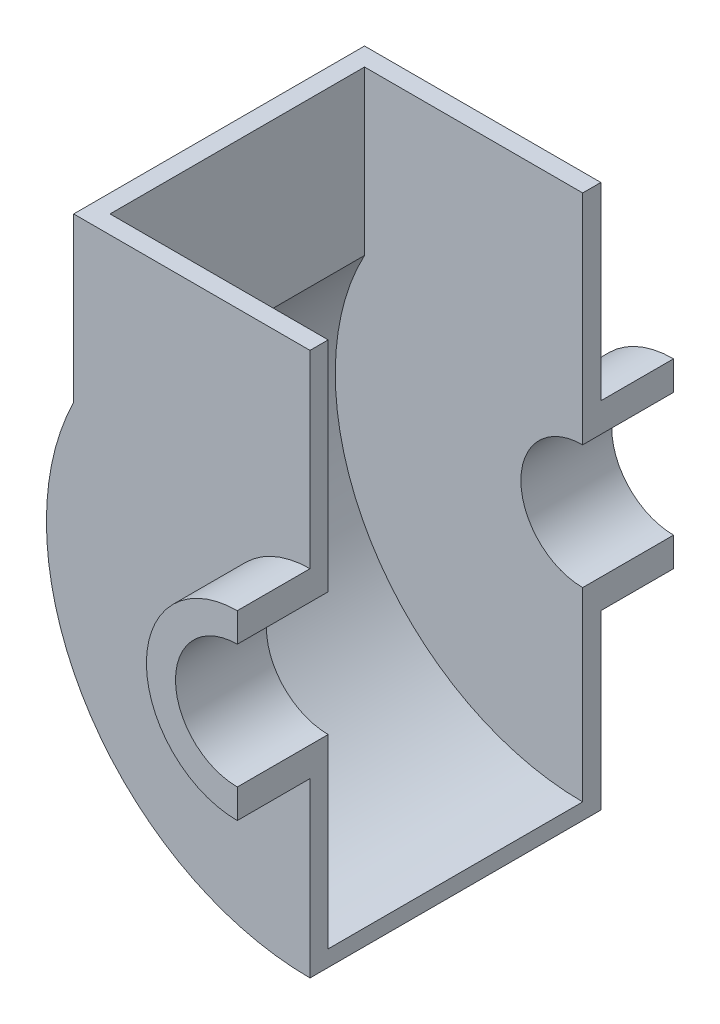
ISO-10303-21;
HEADER;
FILE_DESCRIPTION(('STEP AP214'),'2;1');
FILE_NAME('part.step','',(''),(''),'','','');
FILE_SCHEMA(('AUTOMOTIVE_DESIGN { 1 0 10303 214 1 1 1 1 }'));
ENDSEC;
DATA;
#1=APPLICATION_CONTEXT('core data for automotive mechanical design processes');
#2=APPLICATION_PROTOCOL_DEFINITION('international standard','automotive_design',2000,#1);
#3=PRODUCT_CONTEXT('',#1,'mechanical');
#4=PRODUCT('Part','Part','',(#3));
#5=PRODUCT_RELATED_PRODUCT_CATEGORY('part','',(#4));
#6=PRODUCT_DEFINITION_FORMATION('','',#4);
#7=PRODUCT_DEFINITION_CONTEXT('part definition',#1,'design');
#8=PRODUCT_DEFINITION('design','',#6,#7);
#9=PRODUCT_DEFINITION_SHAPE('','',#8);
#10=(LENGTH_UNIT() NAMED_UNIT(*) SI_UNIT(.MILLI.,.METRE.));
#11=(NAMED_UNIT(*) PLANE_ANGLE_UNIT() SI_UNIT($,.RADIAN.));
#12=(NAMED_UNIT(*) SI_UNIT($,.STERADIAN.) SOLID_ANGLE_UNIT());
#13=UNCERTAINTY_MEASURE_WITH_UNIT(LENGTH_MEASURE(1.E-05),#10,'distance_accuracy_value','');
#14=(GEOMETRIC_REPRESENTATION_CONTEXT(3) GLOBAL_UNCERTAINTY_ASSIGNED_CONTEXT((#13)) GLOBAL_UNIT_ASSIGNED_CONTEXT((#10,
#11,#12)) REPRESENTATION_CONTEXT('',''));
#15=CARTESIAN_POINT('',(0.,0.,0.));
#16=DIRECTION('',(0.,0.,1.));
#17=DIRECTION('',(1.,0.,0.));
#18=AXIS2_PLACEMENT_3D('',#15,#16,#17);
#19=CARTESIAN_POINT('',(0.,0.,-5.));
#20=DIRECTION('',(0.,0.,1.));
#21=DIRECTION('',(1.,0.,0.));
#22=AXIS2_PLACEMENT_3D('',#19,#20,#21);
#23=PLANE('',#22);
#24=CARTESIAN_POINT('',(0.,0.,-5.));
#25=DIRECTION('',(0.,0.,1.));
#26=DIRECTION('',(-1.,0.,0.));
#27=AXIS2_PLACEMENT_3D('',#24,#25,#26);
#28=CIRCLE('',#27,68.053287944081);
#29=CARTESIAN_POINT('',(-60.,32.1130814466628,-5.));
#30=VERTEX_POINT('',#29);
#31=CARTESIAN_POINT('',(0.,-68.053287944081,-5.));
#32=VERTEX_POINT('',#31);
#33=EDGE_CURVE('E196',#30,#32,#28,.T.);
#34=ORIENTED_EDGE('',*,*,#33,.F.);
#35=DIRECTION('',(0.,-1.,0.));
#36=VECTOR('',#35,1.);
#37=CARTESIAN_POINT('',(-60.,77.,-5.));
#38=LINE('',#37,#36);
#39=CARTESIAN_POINT('',(-60.,77.,-5.));
#40=VERTEX_POINT('',#39);
#41=EDGE_CURVE('E55',#40,#30,#38,.T.);
#42=ORIENTED_EDGE('',*,*,#41,.F.);
#43=DIRECTION('',(-1.,0.,0.));
#44=VECTOR('',#43,1.);
#45=CARTESIAN_POINT('',(0.,77.,-5.));
#46=LINE('',#45,#44);
#47=CARTESIAN_POINT('',(0.,77.,-5.));
#48=VERTEX_POINT('',#47);
#49=EDGE_CURVE('E212',#48,#40,#46,.T.);
#50=ORIENTED_EDGE('',*,*,#49,.F.);
#51=DIRECTION('',(0.,1.,0.));
#52=VECTOR('',#51,1.);
#53=CARTESIAN_POINT('',(0.,25.,-5.));
#54=LINE('',#53,#52);
#55=CARTESIAN_POINT('',(0.,17.,-5.));
#56=VERTEX_POINT('',#55);
#57=EDGE_CURVE('E254',#56,#48,#54,.T.);
#58=ORIENTED_EDGE('',*,*,#57,.F.);
#59=CARTESIAN_POINT('',(0.,0.,-5.));
#60=DIRECTION('',(0.,0.,-1.));
#61=DIRECTION('',(1.,0.,0.));
#62=AXIS2_PLACEMENT_3D('',#59,#60,#61);
#63=CIRCLE('',#62,17.);
#64=CARTESIAN_POINT('',(0.,-17.,-5.));
#65=VERTEX_POINT('',#64);
#66=EDGE_CURVE('E251',#65,#56,#63,.T.);
#67=ORIENTED_EDGE('',*,*,#66,.F.);
#68=DIRECTION('',(0.,1.,0.));
#69=VECTOR('',#68,1.);
#70=CARTESIAN_POINT('',(0.,-17.,-5.));
#71=LINE('',#70,#69);
#72=EDGE_CURVE('E61',#32,#65,#71,.T.);
#73=ORIENTED_EDGE('',*,*,#72,.F.);
#74=EDGE_LOOP('',(#34,#42,#50,#58,#67,#73));
#75=FACE_BOUND('',#74,.T.);
#76=ADVANCED_FACE('F38',(#75),#23,.F.);
#77=CARTESIAN_POINT('',(0.,0.,-5.));
#78=DIRECTION('',(0.,0.,1.));
#79=DIRECTION('',(1.,0.,0.));
#80=AXIS2_PLACEMENT_3D('',#77,#78,#79);
#81=CYLINDRICAL_SURFACE('',#80,25.);
#82=CARTESIAN_POINT('',(0.,0.,0.));
#83=DIRECTION('',(0.,0.,1.));
#84=DIRECTION('',(1.,0.,0.));
#85=AXIS2_PLACEMENT_3D('',#82,#83,#84);
#86=CIRCLE('',#85,25.);
#87=CARTESIAN_POINT('',(0.,25.,0.));
#88=VERTEX_POINT('',#87);
#89=CARTESIAN_POINT('',(0.,-25.,0.));
#90=VERTEX_POINT('',#89);
#91=EDGE_CURVE('E205',#88,#90,#86,.T.);
#92=ORIENTED_EDGE('',*,*,#91,.T.);
#93=DIRECTION('',(0.,0.,1.));
#94=VECTOR('',#93,1.);
#95=CARTESIAN_POINT('',(0.,-25.,-5.));
#96=LINE('',#95,#94);
#97=CARTESIAN_POINT('',(0.,-25.,20.));
#98=VERTEX_POINT('',#97);
#99=EDGE_CURVE('E42',#90,#98,#96,.T.);
#100=ORIENTED_EDGE('',*,*,#99,.T.);
#101=CARTESIAN_POINT('',(0.,0.,20.));
#102=DIRECTION('',(0.,0.,1.));
#103=DIRECTION('',(1.,0.,0.));
#104=AXIS2_PLACEMENT_3D('',#101,#102,#103);
#105=CIRCLE('',#104,25.);
#106=CARTESIAN_POINT('',(0.,25.,20.));
#107=VERTEX_POINT('',#106);
#108=EDGE_CURVE('E233',#107,#98,#105,.T.);
#109=ORIENTED_EDGE('',*,*,#108,.F.);
#110=DIRECTION('',(0.,0.,1.));
#111=VECTOR('',#110,1.);
#112=CARTESIAN_POINT('',(0.,25.,-5.));
#113=LINE('',#112,#111);
#114=EDGE_CURVE('E11',#88,#107,#113,.T.);
#115=ORIENTED_EDGE('',*,*,#114,.F.);
#116=EDGE_LOOP('',(#92,#100,#109,#115));
#117=FACE_BOUND('',#116,.T.);
#118=ADVANCED_FACE('F40',(#117),#81,.T.);
#119=CARTESIAN_POINT('',(0.,25.,-5.));
#120=DIRECTION('',(1.,0.,0.));
#121=DIRECTION('',(0.,0.,-1.));
#122=AXIS2_PLACEMENT_3D('',#119,#120,#121);
#123=PLANE('',#122);
#124=ORIENTED_EDGE('',*,*,#57,.T.);
#125=DIRECTION('',(0.,0.,1.));
#126=VECTOR('',#125,1.);
#127=CARTESIAN_POINT('',(0.,77.,-5.));
#128=LINE('',#127,#126);
#129=CARTESIAN_POINT('',(0.,77.,0.));
#130=VERTEX_POINT('',#129);
#131=EDGE_CURVE('E214',#48,#130,#128,.T.);
#132=ORIENTED_EDGE('',*,*,#131,.T.);
#133=DIRECTION('',(0.,1.,0.));
#134=VECTOR('',#133,1.);
#135=CARTESIAN_POINT('',(0.,0.,0.));
#136=LINE('',#135,#134);
#137=EDGE_CURVE('E217',#88,#130,#136,.T.);
#138=ORIENTED_EDGE('',*,*,#137,.F.);
#139=ORIENTED_EDGE('',*,*,#114,.T.);
#140=DIRECTION('',(0.,1.,0.));
#141=VECTOR('',#140,1.);
#142=CARTESIAN_POINT('',(0.,25.,20.));
#143=LINE('',#142,#141);
#144=CARTESIAN_POINT('',(0.,17.,20.));
#145=VERTEX_POINT('',#144);
#146=EDGE_CURVE('E247',#145,#107,#143,.T.);
#147=ORIENTED_EDGE('',*,*,#146,.F.);
#148=DIRECTION('',(0.,0.,1.));
#149=VECTOR('',#148,1.);
#150=CARTESIAN_POINT('',(0.,17.,-5.));
#151=LINE('',#150,#149);
#152=EDGE_CURVE('E47',#56,#145,#151,.T.);
#153=ORIENTED_EDGE('',*,*,#152,.F.);
#154=EDGE_LOOP('',(#124,#132,#138,#139,#147,#153));
#155=FACE_BOUND('',#154,.T.);
#156=ADVANCED_FACE('F271',(#155),#123,.T.);
#157=CARTESIAN_POINT('',(0.,0.,-5.));
#158=DIRECTION('',(0.,0.,1.));
#159=DIRECTION('',(1.,0.,0.));
#160=AXIS2_PLACEMENT_3D('',#157,#158,#159);
#161=CYLINDRICAL_SURFACE('',#160,17.);
#162=ORIENTED_EDGE('',*,*,#152,.T.);
#163=CARTESIAN_POINT('',(0.,0.,20.));
#164=DIRECTION('',(0.,0.,-1.));
#165=DIRECTION('',(1.,0.,0.));
#166=AXIS2_PLACEMENT_3D('',#163,#164,#165);
#167=CIRCLE('',#166,17.);
#168=CARTESIAN_POINT('',(0.,-17.,20.));
#169=VERTEX_POINT('',#168);
#170=EDGE_CURVE('E244',#169,#145,#167,.T.);
#171=ORIENTED_EDGE('',*,*,#170,.F.);
#172=DIRECTION('',(0.,0.,1.));
#173=VECTOR('',#172,1.);
#174=CARTESIAN_POINT('',(0.,-17.,-5.));
#175=LINE('',#174,#173);
#176=EDGE_CURVE('E256',#65,#169,#175,.T.);
#177=ORIENTED_EDGE('',*,*,#176,.F.);
#178=ORIENTED_EDGE('',*,*,#66,.T.);
#179=EDGE_LOOP('',(#162,#171,#177,#178));
#180=FACE_BOUND('',#179,.T.);
#181=ADVANCED_FACE('F323',(#180),#161,.F.);
#182=CARTESIAN_POINT('',(0.,-17.,-5.));
#183=DIRECTION('',(1.,0.,0.));
#184=DIRECTION('',(0.,0.,-1.));
#185=AXIS2_PLACEMENT_3D('',#182,#183,#184);
#186=PLANE('',#185);
#187=ORIENTED_EDGE('',*,*,#176,.T.);
#188=DIRECTION('',(0.,1.,0.));
#189=VECTOR('',#188,1.);
#190=CARTESIAN_POINT('',(0.,-17.,20.));
#191=LINE('',#190,#189);
#192=EDGE_CURVE('E241',#98,#169,#191,.T.);
#193=ORIENTED_EDGE('',*,*,#192,.F.);
#194=ORIENTED_EDGE('',*,*,#99,.F.);
#195=DIRECTION('',(0.,-1.,0.));
#196=VECTOR('',#195,1.);
#197=CARTESIAN_POINT('',(0.,0.,0.));
#198=LINE('',#197,#196);
#199=CARTESIAN_POINT('',(0.,-72.5,0.));
#200=VERTEX_POINT('',#199);
#201=EDGE_CURVE('E215',#90,#200,#198,.T.);
#202=ORIENTED_EDGE('',*,*,#201,.T.);
#203=DIRECTION('',(0.,0.,1.));
#204=VECTOR('',#203,1.);
#205=CARTESIAN_POINT('',(0.,-72.5,-5.));
#206=LINE('',#205,#204);
#207=CARTESIAN_POINT('',(0.,-72.5,-80.));
#208=VERTEX_POINT('',#207);
#209=EDGE_CURVE('E231',#208,#200,#206,.T.);
#210=ORIENTED_EDGE('',*,*,#209,.F.);
#211=DIRECTION('',(0.,-1.,0.));
#212=VECTOR('',#211,1.);
#213=CARTESIAN_POINT('',(0.,0.,-80.));
#214=LINE('',#213,#212);
#215=CARTESIAN_POINT('',(0.,-25.,-80.));
#216=VERTEX_POINT('',#215);
#217=EDGE_CURVE('E165',#216,#208,#214,.T.);
#218=ORIENTED_EDGE('',*,*,#217,.F.);
#219=DIRECTION('',(0.,0.,-1.));
#220=VECTOR('',#219,1.);
#221=CARTESIAN_POINT('',(0.,-25.,-75.));
#222=LINE('',#221,#220);
#223=CARTESIAN_POINT('',(0.,-25.,-100.));
#224=VERTEX_POINT('',#223);
#225=EDGE_CURVE('E180',#216,#224,#222,.T.);
#226=ORIENTED_EDGE('',*,*,#225,.T.);
#227=DIRECTION('',(0.,1.,0.));
#228=VECTOR('',#227,1.);
#229=CARTESIAN_POINT('',(0.,-17.,-100.));
#230=LINE('',#229,#228);
#231=CARTESIAN_POINT('',(0.,-17.,-100.));
#232=VERTEX_POINT('',#231);
#233=EDGE_CURVE('E297',#224,#232,#230,.T.);
#234=ORIENTED_EDGE('',*,*,#233,.T.);
#235=DIRECTION('',(0.,0.,-1.));
#236=VECTOR('',#235,1.);
#237=CARTESIAN_POINT('',(0.,-17.,-75.));
#238=LINE('',#237,#236);
#239=CARTESIAN_POINT('',(0.,-17.,-75.));
#240=VERTEX_POINT('',#239);
#241=EDGE_CURVE('E183',#240,#232,#238,.T.);
#242=ORIENTED_EDGE('',*,*,#241,.F.);
#243=DIRECTION('',(0.,1.,0.));
#244=VECTOR('',#243,1.);
#245=CARTESIAN_POINT('',(0.,-17.,-75.));
#246=LINE('',#245,#244);
#247=CARTESIAN_POINT('',(0.,-68.053287944081,-75.));
#248=VERTEX_POINT('',#247);
#249=EDGE_CURVE('E185',#248,#240,#246,.T.);
#250=ORIENTED_EDGE('',*,*,#249,.F.);
#251=DIRECTION('',(0.,0.,1.));
#252=VECTOR('',#251,1.);
#253=CARTESIAN_POINT('',(0.,-68.053287944081,-241.152038807834));
#254=LINE('',#253,#252);
#255=EDGE_CURVE('E199',#248,#32,#254,.T.);
#256=ORIENTED_EDGE('',*,*,#255,.T.);
#257=ORIENTED_EDGE('',*,*,#72,.T.);
#258=EDGE_LOOP('',(#187,#193,#194,#202,#210,#218,#226,#234,#242,#250,#256,#257));
#259=FACE_BOUND('',#258,.T.);
#260=ADVANCED_FACE('F265',(#259),#186,.T.);
#261=CARTESIAN_POINT('',(0.,0.,20.));
#262=DIRECTION('',(0.,0.,1.));
#263=DIRECTION('',(1.,0.,0.));
#264=AXIS2_PLACEMENT_3D('',#261,#262,#263);
#265=PLANE('',#264);
#266=ORIENTED_EDGE('',*,*,#108,.T.);
#267=ORIENTED_EDGE('',*,*,#192,.T.);
#268=ORIENTED_EDGE('',*,*,#170,.T.);
#269=ORIENTED_EDGE('',*,*,#146,.T.);
#270=EDGE_LOOP('',(#266,#267,#268,#269));
#271=FACE_BOUND('',#270,.T.);
#272=ADVANCED_FACE('F268',(#271),#265,.T.);
#273=CARTESIAN_POINT('',(0.,0.,-5.));
#274=DIRECTION('',(0.,0.,1.));
#275=DIRECTION('',(1.,0.,0.));
#276=AXIS2_PLACEMENT_3D('',#273,#274,#275);
#277=CYLINDRICAL_SURFACE('',#276,72.5);
#278=CARTESIAN_POINT('',(0.,0.,0.));
#279=DIRECTION('',(0.,0.,1.));
#280=DIRECTION('',(1.,0.,0.));
#281=AXIS2_PLACEMENT_3D('',#278,#279,#280);
#282=CIRCLE('',#281,72.5);
#283=CARTESIAN_POINT('',(-65.,32.1130814466628,0.));
#284=VERTEX_POINT('',#283);
#285=EDGE_CURVE('E226',#284,#200,#282,.T.);
#286=ORIENTED_EDGE('',*,*,#285,.F.);
#287=DIRECTION('',(0.,0.,1.));
#288=VECTOR('',#287,1.);
#289=CARTESIAN_POINT('',(-65.,32.1130814466628,-5.));
#290=LINE('',#289,#288);
#291=CARTESIAN_POINT('',(-65.,32.1130814466628,-80.));
#292=VERTEX_POINT('',#291);
#293=EDGE_CURVE('E234',#292,#284,#290,.T.);
#294=ORIENTED_EDGE('',*,*,#293,.F.);
#295=CARTESIAN_POINT('',(0.,0.,-80.));
#296=DIRECTION('',(0.,0.,1.));
#297=DIRECTION('',(1.,0.,0.));
#298=AXIS2_PLACEMENT_3D('',#295,#296,#297);
#299=CIRCLE('',#298,72.5);
#300=EDGE_CURVE('E281',#292,#208,#299,.T.);
#301=ORIENTED_EDGE('',*,*,#300,.T.);
#302=ORIENTED_EDGE('',*,*,#209,.T.);
#303=EDGE_LOOP('',(#286,#294,#301,#302));
#304=FACE_BOUND('',#303,.T.);
#305=ADVANCED_FACE('F282',(#304),#277,.T.);
#306=CARTESIAN_POINT('',(-65.,0.,-5.));
#307=DIRECTION('',(-1.,0.,0.));
#308=DIRECTION('',(0.,-1.,0.));
#309=AXIS2_PLACEMENT_3D('',#306,#307,#308);
#310=PLANE('',#309);
#311=DIRECTION('',(0.,-1.,0.));
#312=VECTOR('',#311,1.);
#313=CARTESIAN_POINT('',(-65.,0.,0.));
#314=LINE('',#313,#312);
#315=CARTESIAN_POINT('',(-65.,77.,0.));
#316=VERTEX_POINT('',#315);
#317=EDGE_CURVE('E223',#316,#284,#314,.T.);
#318=ORIENTED_EDGE('',*,*,#317,.F.);
#319=DIRECTION('',(0.,0.,1.));
#320=VECTOR('',#319,1.);
#321=CARTESIAN_POINT('',(-65.,77.,-5.));
#322=LINE('',#321,#320);
#323=CARTESIAN_POINT('',(-65.,77.,-80.));
#324=VERTEX_POINT('',#323);
#325=EDGE_CURVE('E236',#324,#316,#322,.T.);
#326=ORIENTED_EDGE('',*,*,#325,.F.);
#327=DIRECTION('',(0.,-1.,0.));
#328=VECTOR('',#327,1.);
#329=CARTESIAN_POINT('',(-65.,0.,-80.));
#330=LINE('',#329,#328);
#331=EDGE_CURVE('E286',#324,#292,#330,.T.);
#332=ORIENTED_EDGE('',*,*,#331,.T.);
#333=ORIENTED_EDGE('',*,*,#293,.T.);
#334=EDGE_LOOP('',(#318,#326,#332,#333));
#335=FACE_BOUND('',#334,.T.);
#336=ADVANCED_FACE('F319',(#335),#310,.T.);
#337=CARTESIAN_POINT('',(0.,77.,-5.));
#338=DIRECTION('',(0.,1.,0.));
#339=DIRECTION('',(-1.,0.,0.));
#340=AXIS2_PLACEMENT_3D('',#337,#338,#339);
#341=PLANE('',#340);
#342=DIRECTION('',(-1.,0.,0.));
#343=VECTOR('',#342,1.);
#344=CARTESIAN_POINT('',(0.,77.,0.));
#345=LINE('',#344,#343);
#346=EDGE_CURVE('E220',#130,#316,#345,.T.);
#347=ORIENTED_EDGE('',*,*,#346,.F.);
#348=ORIENTED_EDGE('',*,*,#131,.F.);
#349=ORIENTED_EDGE('',*,*,#49,.T.);
#350=DIRECTION('',(0.,0.,1.));
#351=VECTOR('',#350,1.);
#352=CARTESIAN_POINT('',(-60.,77.,-241.152038807834));
#353=LINE('',#352,#351);
#354=CARTESIAN_POINT('',(-60.,77.,-75.0000000000001));
#355=VERTEX_POINT('',#354);
#356=EDGE_CURVE('E161',#355,#40,#353,.T.);
#357=ORIENTED_EDGE('',*,*,#356,.F.);
#358=DIRECTION('',(-1.,0.,0.));
#359=VECTOR('',#358,1.);
#360=CARTESIAN_POINT('',(0.,77.,-75.));
#361=LINE('',#360,#359);
#362=CARTESIAN_POINT('',(0.,77.,-75.));
#363=VERTEX_POINT('',#362);
#364=EDGE_CURVE('E153',#363,#355,#361,.T.);
#365=ORIENTED_EDGE('',*,*,#364,.F.);
#366=DIRECTION('',(0.,0.,-1.));
#367=VECTOR('',#366,1.);
#368=CARTESIAN_POINT('',(0.,77.,-75.));
#369=LINE('',#368,#367);
#370=CARTESIAN_POINT('',(0.,77.,-80.));
#371=VERTEX_POINT('',#370);
#372=EDGE_CURVE('E158',#363,#371,#369,.T.);
#373=ORIENTED_EDGE('',*,*,#372,.T.);
#374=DIRECTION('',(-1.,0.,0.));
#375=VECTOR('',#374,1.);
#376=CARTESIAN_POINT('',(0.,77.,-80.));
#377=LINE('',#376,#375);
#378=EDGE_CURVE('E314',#371,#324,#377,.T.);
#379=ORIENTED_EDGE('',*,*,#378,.T.);
#380=ORIENTED_EDGE('',*,*,#325,.T.);
#381=EDGE_LOOP('',(#347,#348,#349,#357,#365,#373,#379,#380));
#382=FACE_BOUND('',#381,.T.);
#383=ADVANCED_FACE('F156',(#382),#341,.T.);
#384=CARTESIAN_POINT('',(0.,0.,0.));
#385=DIRECTION('',(0.,0.,1.));
#386=DIRECTION('',(1.,0.,0.));
#387=AXIS2_PLACEMENT_3D('',#384,#385,#386);
#388=PLANE('',#387);
#389=ORIENTED_EDGE('',*,*,#91,.F.);
#390=ORIENTED_EDGE('',*,*,#137,.T.);
#391=ORIENTED_EDGE('',*,*,#346,.T.);
#392=ORIENTED_EDGE('',*,*,#317,.T.);
#393=ORIENTED_EDGE('',*,*,#285,.T.);
#394=ORIENTED_EDGE('',*,*,#201,.F.);
#395=EDGE_LOOP('',(#389,#390,#391,#392,#393,#394));
#396=FACE_BOUND('',#395,.T.);
#397=ADVANCED_FACE('F274',(#396),#388,.T.);
#398=CARTESIAN_POINT('',(-60.,77.,-241.152038807834));
#399=DIRECTION('',(-1.,0.,0.));
#400=DIRECTION('',(0.,-1.,0.));
#401=AXIS2_PLACEMENT_3D('',#398,#399,#400);
#402=PLANE('',#401);
#403=DIRECTION('',(0.,-1.,0.));
#404=VECTOR('',#403,1.);
#405=CARTESIAN_POINT('',(-60.,77.,-75.));
#406=LINE('',#405,#404);
#407=CARTESIAN_POINT('',(-60.,32.1130814466628,-75.0000000000001));
#408=VERTEX_POINT('',#407);
#409=EDGE_CURVE('E206',#355,#408,#406,.T.);
#410=ORIENTED_EDGE('',*,*,#409,.F.);
#411=ORIENTED_EDGE('',*,*,#356,.T.);
#412=ORIENTED_EDGE('',*,*,#41,.T.);
#413=DIRECTION('',(0.,0.,1.));
#414=VECTOR('',#413,1.);
#415=CARTESIAN_POINT('',(-60.,32.1130814466628,-241.152038807834));
#416=LINE('',#415,#414);
#417=EDGE_CURVE('E200',#408,#30,#416,.T.);
#418=ORIENTED_EDGE('',*,*,#417,.F.);
#419=EDGE_LOOP('',(#410,#411,#412,#418));
#420=FACE_BOUND('',#419,.T.);
#421=ADVANCED_FACE('F347',(#420),#402,.F.);
#422=CARTESIAN_POINT('',(0.,0.,-241.152038807834));
#423=DIRECTION('',(0.,0.,1.));
#424=DIRECTION('',(1.,0.,0.));
#425=AXIS2_PLACEMENT_3D('',#422,#423,#424);
#426=CYLINDRICAL_SURFACE('',#425,68.053287944081);
#427=CARTESIAN_POINT('',(0.,0.,-75.));
#428=DIRECTION('',(0.,0.,-1.));
#429=DIRECTION('',(-1.,0.,0.));
#430=AXIS2_PLACEMENT_3D('',#427,#428,#429);
#431=CIRCLE('',#430,68.053287944081);
#432=EDGE_CURVE('E202',#408,#248,#431,.F.);
#433=ORIENTED_EDGE('',*,*,#432,.F.);
#434=ORIENTED_EDGE('',*,*,#417,.T.);
#435=ORIENTED_EDGE('',*,*,#33,.T.);
#436=ORIENTED_EDGE('',*,*,#255,.F.);
#437=EDGE_LOOP('',(#433,#434,#435,#436));
#438=FACE_BOUND('',#437,.T.);
#439=ADVANCED_FACE('F350',(#438),#426,.F.);
#440=CARTESIAN_POINT('',(0.,0.,-75.));
#441=DIRECTION('',(0.,0.,-1.));
#442=DIRECTION('',(1.,0.,0.));
#443=AXIS2_PLACEMENT_3D('',#440,#441,#442);
#444=PLANE('',#443);
#445=ORIENTED_EDGE('',*,*,#364,.T.);
#446=ORIENTED_EDGE('',*,*,#409,.T.);
#447=ORIENTED_EDGE('',*,*,#432,.T.);
#448=ORIENTED_EDGE('',*,*,#249,.T.);
#449=CARTESIAN_POINT('',(0.,0.,-75.));
#450=DIRECTION('',(0.,0.,-1.));
#451=DIRECTION('',(1.,0.,0.));
#452=AXIS2_PLACEMENT_3D('',#449,#450,#451);
#453=CIRCLE('',#452,17.);
#454=CARTESIAN_POINT('',(0.,17.,-75.));
#455=VERTEX_POINT('',#454);
#456=EDGE_CURVE('E178',#240,#455,#453,.T.);
#457=ORIENTED_EDGE('',*,*,#456,.T.);
#458=DIRECTION('',(0.,1.,0.));
#459=VECTOR('',#458,1.);
#460=CARTESIAN_POINT('',(0.,25.,-75.));
#461=LINE('',#460,#459);
#462=EDGE_CURVE('E171',#455,#363,#461,.T.);
#463=ORIENTED_EDGE('',*,*,#462,.T.);
#464=EDGE_LOOP('',(#445,#446,#447,#448,#457,#463));
#465=FACE_BOUND('',#464,.T.);
#466=ADVANCED_FACE('F176',(#465),#444,.F.);
#467=CARTESIAN_POINT('',(0.,0.,-75.));
#468=DIRECTION('',(0.,0.,-1.));
#469=DIRECTION('',(1.,0.,0.));
#470=AXIS2_PLACEMENT_3D('',#467,#468,#469);
#471=CYLINDRICAL_SURFACE('',#470,25.);
#472=CARTESIAN_POINT('',(0.,0.,-80.));
#473=DIRECTION('',(0.,0.,1.));
#474=DIRECTION('',(1.,0.,0.));
#475=AXIS2_PLACEMENT_3D('',#472,#473,#474);
#476=CIRCLE('',#475,25.);
#477=CARTESIAN_POINT('',(0.,25.,-80.));
#478=VERTEX_POINT('',#477);
#479=EDGE_CURVE('E291',#478,#216,#476,.T.);
#480=ORIENTED_EDGE('',*,*,#479,.F.);
#481=DIRECTION('',(0.,0.,-1.));
#482=VECTOR('',#481,1.);
#483=CARTESIAN_POINT('',(0.,25.,-75.));
#484=LINE('',#483,#482);
#485=CARTESIAN_POINT('',(0.,25.,-100.));
#486=VERTEX_POINT('',#485);
#487=EDGE_CURVE('E189',#478,#486,#484,.T.);
#488=ORIENTED_EDGE('',*,*,#487,.T.);
#489=CARTESIAN_POINT('',(0.,0.,-100.));
#490=DIRECTION('',(0.,0.,1.));
#491=DIRECTION('',(1.,0.,0.));
#492=AXIS2_PLACEMENT_3D('',#489,#490,#491);
#493=CIRCLE('',#492,25.);
#494=EDGE_CURVE('E174',#486,#224,#493,.T.);
#495=ORIENTED_EDGE('',*,*,#494,.T.);
#496=ORIENTED_EDGE('',*,*,#225,.F.);
#497=EDGE_LOOP('',(#480,#488,#495,#496));
#498=FACE_BOUND('',#497,.T.);
#499=ADVANCED_FACE('F312',(#498),#471,.T.);
#500=CARTESIAN_POINT('',(0.,25.,-75.));
#501=DIRECTION('',(1.,0.,0.));
#502=DIRECTION('',(0.,0.,1.));
#503=AXIS2_PLACEMENT_3D('',#500,#501,#502);
#504=PLANE('',#503);
#505=ORIENTED_EDGE('',*,*,#462,.F.);
#506=DIRECTION('',(0.,0.,-1.));
#507=VECTOR('',#506,1.);
#508=CARTESIAN_POINT('',(0.,17.,-75.));
#509=LINE('',#508,#507);
#510=CARTESIAN_POINT('',(0.,17.,-100.));
#511=VERTEX_POINT('',#510);
#512=EDGE_CURVE('E192',#455,#511,#509,.T.);
#513=ORIENTED_EDGE('',*,*,#512,.T.);
#514=DIRECTION('',(0.,1.,0.));
#515=VECTOR('',#514,1.);
#516=CARTESIAN_POINT('',(0.,25.,-100.));
#517=LINE('',#516,#515);
#518=EDGE_CURVE('E301',#511,#486,#517,.T.);
#519=ORIENTED_EDGE('',*,*,#518,.T.);
#520=ORIENTED_EDGE('',*,*,#487,.F.);
#521=DIRECTION('',(0.,1.,0.));
#522=VECTOR('',#521,1.);
#523=CARTESIAN_POINT('',(0.,0.,-80.));
#524=LINE('',#523,#522);
#525=EDGE_CURVE('E173',#478,#371,#524,.T.);
#526=ORIENTED_EDGE('',*,*,#525,.T.);
#527=ORIENTED_EDGE('',*,*,#372,.F.);
#528=EDGE_LOOP('',(#505,#513,#519,#520,#526,#527));
#529=FACE_BOUND('',#528,.T.);
#530=ADVANCED_FACE('F169',(#529),#504,.T.);
#531=CARTESIAN_POINT('',(0.,0.,-75.));
#532=DIRECTION('',(0.,0.,-1.));
#533=DIRECTION('',(1.,0.,0.));
#534=AXIS2_PLACEMENT_3D('',#531,#532,#533);
#535=CYLINDRICAL_SURFACE('',#534,17.);
#536=ORIENTED_EDGE('',*,*,#512,.F.);
#537=ORIENTED_EDGE('',*,*,#456,.F.);
#538=ORIENTED_EDGE('',*,*,#241,.T.);
#539=CARTESIAN_POINT('',(0.,0.,-100.));
#540=DIRECTION('',(0.,0.,-1.));
#541=DIRECTION('',(1.,0.,0.));
#542=AXIS2_PLACEMENT_3D('',#539,#540,#541);
#543=CIRCLE('',#542,17.);
#544=EDGE_CURVE('E299',#232,#511,#543,.T.);
#545=ORIENTED_EDGE('',*,*,#544,.T.);
#546=EDGE_LOOP('',(#536,#537,#538,#545));
#547=FACE_BOUND('',#546,.T.);
#548=ADVANCED_FACE('F306',(#547),#535,.F.);
#549=CARTESIAN_POINT('',(0.,0.,-100.));
#550=DIRECTION('',(0.,0.,-1.));
#551=DIRECTION('',(1.,0.,0.));
#552=AXIS2_PLACEMENT_3D('',#549,#550,#551);
#553=PLANE('',#552);
#554=ORIENTED_EDGE('',*,*,#494,.F.);
#555=ORIENTED_EDGE('',*,*,#518,.F.);
#556=ORIENTED_EDGE('',*,*,#544,.F.);
#557=ORIENTED_EDGE('',*,*,#233,.F.);
#558=EDGE_LOOP('',(#554,#555,#556,#557));
#559=FACE_BOUND('',#558,.T.);
#560=ADVANCED_FACE('F310',(#559),#553,.T.);
#561=CARTESIAN_POINT('',(0.,0.,-80.));
#562=DIRECTION('',(0.,0.,-1.));
#563=DIRECTION('',(1.,0.,0.));
#564=AXIS2_PLACEMENT_3D('',#561,#562,#563);
#565=PLANE('',#564);
#566=ORIENTED_EDGE('',*,*,#479,.T.);
#567=ORIENTED_EDGE('',*,*,#217,.T.);
#568=ORIENTED_EDGE('',*,*,#300,.F.);
#569=ORIENTED_EDGE('',*,*,#331,.F.);
#570=ORIENTED_EDGE('',*,*,#378,.F.);
#571=ORIENTED_EDGE('',*,*,#525,.F.);
#572=EDGE_LOOP('',(#566,#567,#568,#569,#570,#571));
#573=FACE_BOUND('',#572,.T.);
#574=ADVANCED_FACE('F289',(#573),#565,.T.);
#575=CLOSED_SHELL('',(#76,#118,#156,#181,#260,#272,#305,#336,#383,#397,#421,#439,#466,#499,#530,
#548,#560,#574));
#576=MANIFOLD_SOLID_BREP('B2',#575);
#577=ADVANCED_BREP_SHAPE_REPRESENTATION('',(#18,#576),#14);
#578=SHAPE_DEFINITION_REPRESENTATION(#9,#577);
ENDSEC;
END-ISO-10303-21;
